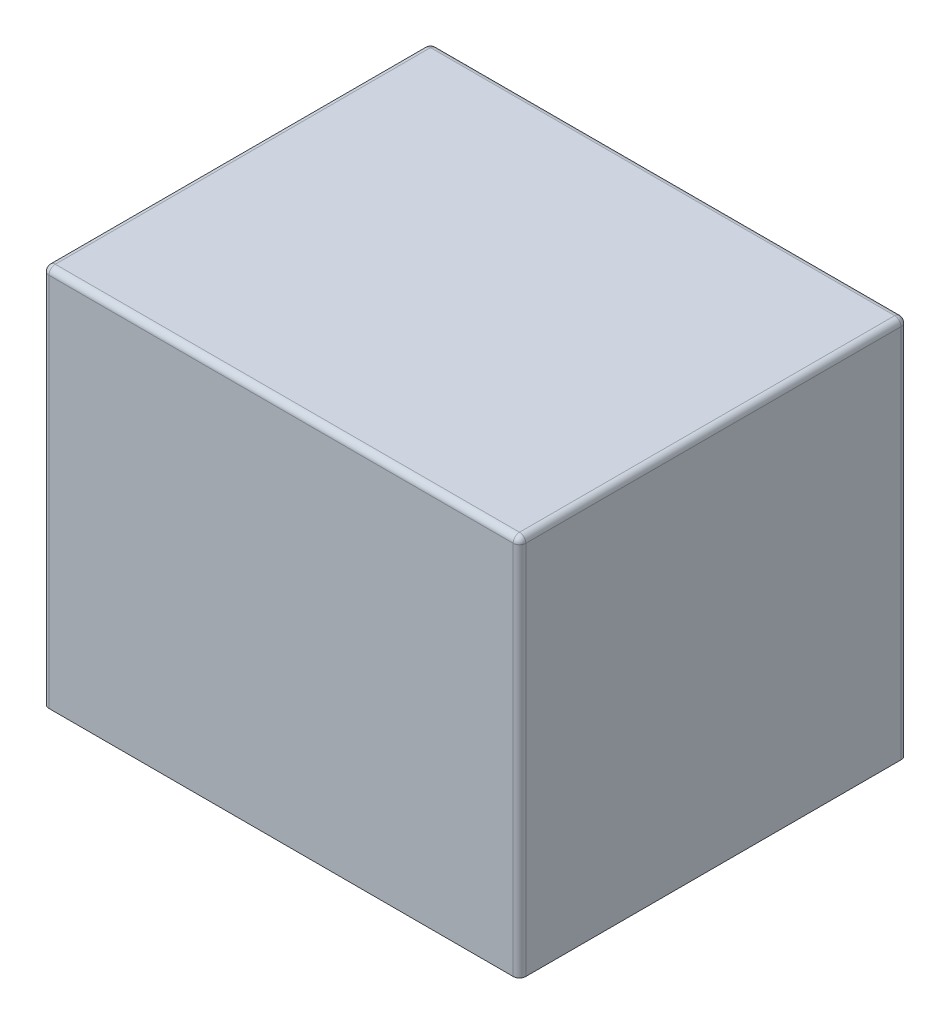
ISO-10303-21;
HEADER;
FILE_DESCRIPTION(('STEP AP214'),'2;1');
FILE_NAME('part.step','',(''),(''),'','','');
FILE_SCHEMA(('AUTOMOTIVE_DESIGN { 1 0 10303 214 1 1 1 1 }'));
ENDSEC;
DATA;
#1=APPLICATION_CONTEXT('core data for automotive mechanical design processes');
#2=APPLICATION_PROTOCOL_DEFINITION('international standard','automotive_design',2000,#1);
#3=PRODUCT_CONTEXT('',#1,'mechanical');
#4=PRODUCT('Part','Part','',(#3));
#5=PRODUCT_RELATED_PRODUCT_CATEGORY('part','',(#4));
#6=PRODUCT_DEFINITION_FORMATION('','',#4);
#7=PRODUCT_DEFINITION_CONTEXT('part definition',#1,'design');
#8=PRODUCT_DEFINITION('design','',#6,#7);
#9=PRODUCT_DEFINITION_SHAPE('','',#8);
#10=(LENGTH_UNIT() NAMED_UNIT(*) SI_UNIT(.MILLI.,.METRE.));
#11=(NAMED_UNIT(*) PLANE_ANGLE_UNIT() SI_UNIT($,.RADIAN.));
#12=(NAMED_UNIT(*) SI_UNIT($,.STERADIAN.) SOLID_ANGLE_UNIT());
#13=UNCERTAINTY_MEASURE_WITH_UNIT(LENGTH_MEASURE(1.E-05),#10,'distance_accuracy_value','');
#14=(GEOMETRIC_REPRESENTATION_CONTEXT(3) GLOBAL_UNCERTAINTY_ASSIGNED_CONTEXT((#13)) GLOBAL_UNIT_ASSIGNED_CONTEXT((#10,
#11,#12)) REPRESENTATION_CONTEXT('',''));
#15=CARTESIAN_POINT('',(0.,0.,0.));
#16=DIRECTION('',(0.,0.,1.));
#17=DIRECTION('',(1.,0.,0.));
#18=AXIS2_PLACEMENT_3D('',#15,#16,#17);
#19=CARTESIAN_POINT('',(0.,0.,-15.494));
#20=DIRECTION('',(-1.,0.,0.));
#21=DIRECTION('',(0.,0.,1.));
#22=AXIS2_PLACEMENT_3D('',#19,#20,#21);
#23=PLANE('',#22);
#24=DIRECTION('',(0.,0.,1.));
#25=VECTOR('',#24,1.);
#26=CARTESIAN_POINT('',(0.,0.,-15.494));
#27=LINE('',#26,#25);
#28=CARTESIAN_POINT('',(0.,0.,-15.24));
#29=VERTEX_POINT('',#28);
#30=CARTESIAN_POINT('',(0.,0.,-0.254000000000001));
#31=VERTEX_POINT('',#30);
#32=EDGE_CURVE('E139',#29,#31,#27,.T.);
#33=ORIENTED_EDGE('',*,*,#32,.T.);
#34=DIRECTION('',(0.,-1.,0.));
#35=VECTOR('',#34,1.);
#36=CARTESIAN_POINT('',(0.,15.24,-0.254));
#37=LINE('',#36,#35);
#38=CARTESIAN_POINT('',(0.,14.986,-0.254));
#39=VERTEX_POINT('',#38);
#40=EDGE_CURVE('E114',#31,#39,#37,.F.);
#41=ORIENTED_EDGE('',*,*,#40,.T.);
#42=DIRECTION('',(0.,0.,1.));
#43=VECTOR('',#42,1.);
#44=CARTESIAN_POINT('',(0.,14.986,-15.494));
#45=LINE('',#44,#43);
#46=CARTESIAN_POINT('',(0.,14.986,-15.24));
#47=VERTEX_POINT('',#46);
#48=EDGE_CURVE('E154',#39,#47,#45,.F.);
#49=ORIENTED_EDGE('',*,*,#48,.T.);
#50=DIRECTION('',(0.,-1.,0.));
#51=VECTOR('',#50,1.);
#52=CARTESIAN_POINT('',(0.,0.,-15.24));
#53=LINE('',#52,#51);
#54=EDGE_CURVE('E119',#47,#29,#53,.T.);
#55=ORIENTED_EDGE('',*,*,#54,.T.);
#56=EDGE_LOOP('',(#33,#41,#49,#55));
#57=FACE_BOUND('',#56,.T.);
#58=ADVANCED_FACE('F33',(#57),#23,.T.);
#59=CARTESIAN_POINT('',(0.,15.24,-15.494));
#60=DIRECTION('',(0.,1.,0.));
#61=DIRECTION('',(0.,0.,1.));
#62=AXIS2_PLACEMENT_3D('',#59,#60,#61);
#63=PLANE('',#62);
#64=DIRECTION('',(-1.,0.,0.));
#65=VECTOR('',#64,1.);
#66=CARTESIAN_POINT('',(0.,15.24,-15.24));
#67=LINE('',#66,#65);
#68=CARTESIAN_POINT('',(18.796,15.24,-15.24));
#69=VERTEX_POINT('',#68);
#70=CARTESIAN_POINT('',(0.254,15.24,-15.24));
#71=VERTEX_POINT('',#70);
#72=EDGE_CURVE('E161',#69,#71,#67,.T.);
#73=ORIENTED_EDGE('',*,*,#72,.T.);
#74=DIRECTION('',(0.,0.,1.));
#75=VECTOR('',#74,1.);
#76=CARTESIAN_POINT('',(0.254,15.24,-15.494));
#77=LINE('',#76,#75);
#78=CARTESIAN_POINT('',(0.254,15.24,-0.254));
#79=VERTEX_POINT('',#78);
#80=EDGE_CURVE('E163',#71,#79,#77,.T.);
#81=ORIENTED_EDGE('',*,*,#80,.T.);
#82=DIRECTION('',(-1.,0.,0.));
#83=VECTOR('',#82,1.);
#84=CARTESIAN_POINT('',(19.05,15.24,-0.254));
#85=LINE('',#84,#83);
#86=CARTESIAN_POINT('',(18.796,15.24,-0.254));
#87=VERTEX_POINT('',#86);
#88=EDGE_CURVE('E157',#79,#87,#85,.F.);
#89=ORIENTED_EDGE('',*,*,#88,.T.);
#90=DIRECTION('',(0.,0.,1.));
#91=VECTOR('',#90,1.);
#92=CARTESIAN_POINT('',(18.796,15.24,-15.494));
#93=LINE('',#92,#91);
#94=EDGE_CURVE('E159',#87,#69,#93,.F.);
#95=ORIENTED_EDGE('',*,*,#94,.T.);
#96=EDGE_LOOP('',(#73,#81,#89,#95));
#97=FACE_BOUND('',#96,.T.);
#98=ADVANCED_FACE('F234',(#97),#63,.T.);
#99=CARTESIAN_POINT('',(19.05,0.,-15.494));
#100=DIRECTION('',(1.,0.,0.));
#101=DIRECTION('',(0.,0.,-1.));
#102=AXIS2_PLACEMENT_3D('',#99,#100,#101);
#103=PLANE('',#102);
#104=DIRECTION('',(0.,0.,1.));
#105=VECTOR('',#104,1.);
#106=CARTESIAN_POINT('',(19.05,0.,-15.494));
#107=LINE('',#106,#105);
#108=CARTESIAN_POINT('',(19.05,0.,-15.24));
#109=VERTEX_POINT('',#108);
#110=CARTESIAN_POINT('',(19.05,0.,-0.254000000000001));
#111=VERTEX_POINT('',#110);
#112=EDGE_CURVE('E144',#109,#111,#107,.T.);
#113=ORIENTED_EDGE('',*,*,#112,.F.);
#114=DIRECTION('',(0.,1.,0.));
#115=VECTOR('',#114,1.);
#116=CARTESIAN_POINT('',(19.05,0.,-15.24));
#117=LINE('',#116,#115);
#118=CARTESIAN_POINT('',(19.05,14.986,-15.24));
#119=VERTEX_POINT('',#118);
#120=EDGE_CURVE('E11',#109,#119,#117,.T.);
#121=ORIENTED_EDGE('',*,*,#120,.T.);
#122=DIRECTION('',(0.,0.,1.));
#123=VECTOR('',#122,1.);
#124=CARTESIAN_POINT('',(19.05,14.986,-15.494));
#125=LINE('',#124,#123);
#126=CARTESIAN_POINT('',(19.05,14.986,-0.254));
#127=VERTEX_POINT('',#126);
#128=EDGE_CURVE('E42',#119,#127,#125,.T.);
#129=ORIENTED_EDGE('',*,*,#128,.T.);
#130=DIRECTION('',(0.,1.,0.));
#131=VECTOR('',#130,1.);
#132=CARTESIAN_POINT('',(19.05,0.,-0.254));
#133=LINE('',#132,#131);
#134=EDGE_CURVE('E172',#127,#111,#133,.F.);
#135=ORIENTED_EDGE('',*,*,#134,.T.);
#136=EDGE_LOOP('',(#113,#121,#129,#135));
#137=FACE_BOUND('',#136,.T.);
#138=ADVANCED_FACE('F245',(#137),#103,.T.);
#139=CARTESIAN_POINT('',(0.,0.,-15.494));
#140=DIRECTION('',(0.,-1.,0.));
#141=DIRECTION('',(0.,0.,-1.));
#142=AXIS2_PLACEMENT_3D('',#139,#140,#141);
#143=PLANE('',#142);
#144=DIRECTION('',(1.,0.,0.));
#145=VECTOR('',#144,1.);
#146=CARTESIAN_POINT('',(0.,0.,0.));
#147=LINE('',#146,#145);
#148=CARTESIAN_POINT('',(0.254,0.,0.));
#149=VERTEX_POINT('',#148);
#150=CARTESIAN_POINT('',(18.796,0.,0.));
#151=VERTEX_POINT('',#150);
#152=EDGE_CURVE('E125',#149,#151,#147,.T.);
#153=ORIENTED_EDGE('',*,*,#152,.F.);
#154=CARTESIAN_POINT('',(0.254,0.,-0.254));
#155=DIRECTION('',(0.,-1.,0.));
#156=DIRECTION('',(0.,0.,-1.));
#157=AXIS2_PLACEMENT_3D('',#154,#155,#156);
#158=CIRCLE('',#157,0.254);
#159=EDGE_CURVE('E109',#149,#31,#158,.T.);
#160=ORIENTED_EDGE('',*,*,#159,.T.);
#161=ORIENTED_EDGE('',*,*,#32,.F.);
#162=CARTESIAN_POINT('',(0.254,0.,-15.24));
#163=DIRECTION('',(0.,-1.,0.));
#164=DIRECTION('',(0.,0.,-1.));
#165=AXIS2_PLACEMENT_3D('',#162,#163,#164);
#166=CIRCLE('',#165,0.254);
#167=CARTESIAN_POINT('',(0.254,0.,-15.494));
#168=VERTEX_POINT('',#167);
#169=EDGE_CURVE('E120',#29,#168,#166,.T.);
#170=ORIENTED_EDGE('',*,*,#169,.T.);
#171=DIRECTION('',(1.,0.,0.));
#172=VECTOR('',#171,1.);
#173=CARTESIAN_POINT('',(0.,0.,-15.494));
#174=LINE('',#173,#172);
#175=CARTESIAN_POINT('',(18.796,0.,-15.494));
#176=VERTEX_POINT('',#175);
#177=EDGE_CURVE('E136',#168,#176,#174,.T.);
#178=ORIENTED_EDGE('',*,*,#177,.T.);
#179=CARTESIAN_POINT('',(18.796,0.,-15.24));
#180=DIRECTION('',(0.,-1.,0.));
#181=DIRECTION('',(0.,0.,-1.));
#182=AXIS2_PLACEMENT_3D('',#179,#180,#181);
#183=CIRCLE('',#182,0.254);
#184=EDGE_CURVE('E150',#176,#109,#183,.T.);
#185=ORIENTED_EDGE('',*,*,#184,.T.);
#186=ORIENTED_EDGE('',*,*,#112,.T.);
#187=CARTESIAN_POINT('',(18.796,0.,-0.254));
#188=DIRECTION('',(0.,-1.,0.));
#189=DIRECTION('',(0.,0.,-1.));
#190=AXIS2_PLACEMENT_3D('',#187,#188,#189);
#191=CIRCLE('',#190,0.254);
#192=EDGE_CURVE('E130',#111,#151,#191,.T.);
#193=ORIENTED_EDGE('',*,*,#192,.T.);
#194=EDGE_LOOP('',(#153,#160,#161,#170,#178,#185,#186,#193));
#195=FACE_BOUND('',#194,.T.);
#196=ADVANCED_FACE('F133',(#195),#143,.T.);
#197=CARTESIAN_POINT('',(0.,0.,-15.494));
#198=DIRECTION('',(0.,0.,-1.));
#199=DIRECTION('',(-1.,0.,0.));
#200=AXIS2_PLACEMENT_3D('',#197,#198,#199);
#201=PLANE('',#200);
#202=ORIENTED_EDGE('',*,*,#177,.F.);
#203=DIRECTION('',(0.,-1.,0.));
#204=VECTOR('',#203,1.);
#205=CARTESIAN_POINT('',(0.254,0.,-15.494));
#206=LINE('',#205,#204);
#207=CARTESIAN_POINT('',(0.254,14.986,-15.494));
#208=VERTEX_POINT('',#207);
#209=EDGE_CURVE('E170',#168,#208,#206,.F.);
#210=ORIENTED_EDGE('',*,*,#209,.T.);
#211=DIRECTION('',(-1.,0.,0.));
#212=VECTOR('',#211,1.);
#213=CARTESIAN_POINT('',(0.,14.986,-15.494));
#214=LINE('',#213,#212);
#215=CARTESIAN_POINT('',(18.796,14.986,-15.494));
#216=VERTEX_POINT('',#215);
#217=EDGE_CURVE('E168',#208,#216,#214,.F.);
#218=ORIENTED_EDGE('',*,*,#217,.T.);
#219=DIRECTION('',(0.,1.,0.));
#220=VECTOR('',#219,1.);
#221=CARTESIAN_POINT('',(18.796,0.,-15.494));
#222=LINE('',#221,#220);
#223=EDGE_CURVE('E166',#216,#176,#222,.F.);
#224=ORIENTED_EDGE('',*,*,#223,.T.);
#225=EDGE_LOOP('',(#202,#210,#218,#224));
#226=FACE_BOUND('',#225,.T.);
#227=ADVANCED_FACE('F218',(#226),#201,.T.);
#228=CARTESIAN_POINT('',(0.,0.,0.));
#229=DIRECTION('',(0.,0.,-1.));
#230=DIRECTION('',(-1.,0.,0.));
#231=AXIS2_PLACEMENT_3D('',#228,#229,#230);
#232=PLANE('',#231);
#233=DIRECTION('',(-1.,0.,0.));
#234=VECTOR('',#233,1.);
#235=CARTESIAN_POINT('',(0.,14.986,0.));
#236=LINE('',#235,#234);
#237=CARTESIAN_POINT('',(18.796,14.986,0.));
#238=VERTEX_POINT('',#237);
#239=CARTESIAN_POINT('',(0.254,14.986,0.));
#240=VERTEX_POINT('',#239);
#241=EDGE_CURVE('E128',#238,#240,#236,.T.);
#242=ORIENTED_EDGE('',*,*,#241,.T.);
#243=DIRECTION('',(0.,-1.,0.));
#244=VECTOR('',#243,1.);
#245=CARTESIAN_POINT('',(0.254,0.,0.));
#246=LINE('',#245,#244);
#247=EDGE_CURVE('E113',#240,#149,#246,.T.);
#248=ORIENTED_EDGE('',*,*,#247,.T.);
#249=ORIENTED_EDGE('',*,*,#152,.T.);
#250=DIRECTION('',(0.,1.,0.));
#251=VECTOR('',#250,1.);
#252=CARTESIAN_POINT('',(18.796,15.24,0.));
#253=LINE('',#252,#251);
#254=EDGE_CURVE('E131',#151,#238,#253,.T.);
#255=ORIENTED_EDGE('',*,*,#254,.T.);
#256=EDGE_LOOP('',(#242,#248,#249,#255));
#257=FACE_BOUND('',#256,.T.);
#258=ADVANCED_FACE('F124',(#257),#232,.F.);
#259=CARTESIAN_POINT('',(18.796,0.,-15.24));
#260=DIRECTION('',(0.,1.,0.));
#261=DIRECTION('',(0.,0.,1.));
#262=AXIS2_PLACEMENT_3D('',#259,#260,#261);
#263=CYLINDRICAL_SURFACE('',#262,0.254);
#264=CARTESIAN_POINT('',(18.796,14.986,-15.24));
#265=DIRECTION('',(0.,1.,0.));
#266=DIRECTION('',(0.,0.,1.));
#267=AXIS2_PLACEMENT_3D('',#264,#265,#266);
#268=CIRCLE('',#267,0.254);
#269=EDGE_CURVE('E37',#119,#216,#268,.T.);
#270=ORIENTED_EDGE('',*,*,#269,.F.);
#271=ORIENTED_EDGE('',*,*,#120,.F.);
#272=ORIENTED_EDGE('',*,*,#184,.F.);
#273=ORIENTED_EDGE('',*,*,#223,.F.);
#274=EDGE_LOOP('',(#270,#271,#272,#273));
#275=FACE_BOUND('',#274,.T.);
#276=ADVANCED_FACE('F35',(#275),#263,.T.);
#277=CARTESIAN_POINT('',(18.796,14.986,-15.24));
#278=DIRECTION('',(0.,0.,1.));
#279=DIRECTION('',(1.,0.,0.));
#280=AXIS2_PLACEMENT_3D('',#277,#278,#279);
#281=SPHERICAL_SURFACE('',#280,0.254);
#282=CARTESIAN_POINT('',(18.796,14.986,-15.24));
#283=DIRECTION('',(0.,0.,-1.));
#284=DIRECTION('',(-1.,0.,0.));
#285=AXIS2_PLACEMENT_3D('',#282,#283,#284);
#286=CIRCLE('',#285,0.254);
#287=EDGE_CURVE('E200',#119,#69,#286,.F.);
#288=ORIENTED_EDGE('',*,*,#287,.F.);
#289=ORIENTED_EDGE('',*,*,#269,.T.);
#290=CARTESIAN_POINT('',(18.796,14.986,-15.24));
#291=DIRECTION('',(1.,0.,0.));
#292=DIRECTION('',(0.,0.,-1.));
#293=AXIS2_PLACEMENT_3D('',#290,#291,#292);
#294=CIRCLE('',#293,0.254);
#295=EDGE_CURVE('E142',#69,#216,#294,.F.);
#296=ORIENTED_EDGE('',*,*,#295,.F.);
#297=EDGE_LOOP('',(#288,#289,#296));
#298=FACE_BOUND('',#297,.T.);
#299=ADVANCED_FACE('F212',(#298),#281,.T.);
#300=CARTESIAN_POINT('',(0.254,0.,-15.24));
#301=DIRECTION('',(0.,-1.,0.));
#302=DIRECTION('',(0.,0.,-1.));
#303=AXIS2_PLACEMENT_3D('',#300,#301,#302);
#304=CYLINDRICAL_SURFACE('',#303,0.254);
#305=ORIENTED_EDGE('',*,*,#169,.F.);
#306=ORIENTED_EDGE('',*,*,#54,.F.);
#307=CARTESIAN_POINT('',(0.254,14.986,-15.24));
#308=DIRECTION('',(0.,1.,0.));
#309=DIRECTION('',(0.,0.,1.));
#310=AXIS2_PLACEMENT_3D('',#307,#308,#309);
#311=CIRCLE('',#310,0.254);
#312=EDGE_CURVE('E197',#208,#47,#311,.T.);
#313=ORIENTED_EDGE('',*,*,#312,.F.);
#314=ORIENTED_EDGE('',*,*,#209,.F.);
#315=EDGE_LOOP('',(#305,#306,#313,#314));
#316=FACE_BOUND('',#315,.T.);
#317=ADVANCED_FACE('F223',(#316),#304,.T.);
#318=CARTESIAN_POINT('',(0.,14.986,-15.24));
#319=DIRECTION('',(-1.,0.,0.));
#320=DIRECTION('',(0.,0.,1.));
#321=AXIS2_PLACEMENT_3D('',#318,#319,#320);
#322=CYLINDRICAL_SURFACE('',#321,0.254);
#323=ORIENTED_EDGE('',*,*,#295,.T.);
#324=ORIENTED_EDGE('',*,*,#217,.F.);
#325=CARTESIAN_POINT('',(0.254,14.986,-15.24));
#326=DIRECTION('',(-1.,0.,0.));
#327=DIRECTION('',(0.,0.,1.));
#328=AXIS2_PLACEMENT_3D('',#325,#326,#327);
#329=CIRCLE('',#328,0.254);
#330=EDGE_CURVE('E194',#71,#208,#329,.T.);
#331=ORIENTED_EDGE('',*,*,#330,.F.);
#332=ORIENTED_EDGE('',*,*,#72,.F.);
#333=EDGE_LOOP('',(#323,#324,#331,#332));
#334=FACE_BOUND('',#333,.T.);
#335=ADVANCED_FACE('F207',(#334),#322,.T.);
#336=CARTESIAN_POINT('',(18.796,14.986,-15.494));
#337=DIRECTION('',(0.,0.,1.));
#338=DIRECTION('',(1.,0.,0.));
#339=AXIS2_PLACEMENT_3D('',#336,#337,#338);
#340=CYLINDRICAL_SURFACE('',#339,0.254);
#341=ORIENTED_EDGE('',*,*,#287,.T.);
#342=ORIENTED_EDGE('',*,*,#94,.F.);
#343=CARTESIAN_POINT('',(18.796,14.986,-0.254));
#344=DIRECTION('',(0.,0.,1.));
#345=DIRECTION('',(1.,0.,0.));
#346=AXIS2_PLACEMENT_3D('',#343,#344,#345);
#347=CIRCLE('',#346,0.254);
#348=EDGE_CURVE('E191',#127,#87,#347,.T.);
#349=ORIENTED_EDGE('',*,*,#348,.F.);
#350=ORIENTED_EDGE('',*,*,#128,.F.);
#351=EDGE_LOOP('',(#341,#342,#349,#350));
#352=FACE_BOUND('',#351,.T.);
#353=ADVANCED_FACE('F238',(#352),#340,.T.);
#354=CARTESIAN_POINT('',(18.796,0.,-0.254));
#355=DIRECTION('',(0.,-1.,0.));
#356=DIRECTION('',(0.,0.,-1.));
#357=AXIS2_PLACEMENT_3D('',#354,#355,#356);
#358=CYLINDRICAL_SURFACE('',#357,0.254);
#359=ORIENTED_EDGE('',*,*,#192,.F.);
#360=ORIENTED_EDGE('',*,*,#134,.F.);
#361=CARTESIAN_POINT('',(18.796,14.986,-0.254));
#362=DIRECTION('',(0.,1.,0.));
#363=DIRECTION('',(0.,0.,1.));
#364=AXIS2_PLACEMENT_3D('',#361,#362,#363);
#365=CIRCLE('',#364,0.254);
#366=EDGE_CURVE('E188',#238,#127,#365,.T.);
#367=ORIENTED_EDGE('',*,*,#366,.F.);
#368=ORIENTED_EDGE('',*,*,#254,.F.);
#369=EDGE_LOOP('',(#359,#360,#367,#368));
#370=FACE_BOUND('',#369,.T.);
#371=ADVANCED_FACE('F244',(#370),#358,.T.);
#372=CARTESIAN_POINT('',(0.254,14.986,-15.24));
#373=DIRECTION('',(0.,0.,1.));
#374=DIRECTION('',(1.,0.,0.));
#375=AXIS2_PLACEMENT_3D('',#372,#373,#374);
#376=SPHERICAL_SURFACE('',#375,0.254);
#377=ORIENTED_EDGE('',*,*,#330,.T.);
#378=ORIENTED_EDGE('',*,*,#312,.T.);
#379=CARTESIAN_POINT('',(0.254,14.986,-15.24));
#380=DIRECTION('',(0.,0.,-1.));
#381=DIRECTION('',(-1.,0.,0.));
#382=AXIS2_PLACEMENT_3D('',#379,#380,#381);
#383=CIRCLE('',#382,0.254);
#384=EDGE_CURVE('E185',#71,#47,#383,.F.);
#385=ORIENTED_EDGE('',*,*,#384,.F.);
#386=EDGE_LOOP('',(#377,#378,#385));
#387=FACE_BOUND('',#386,.T.);
#388=ADVANCED_FACE('F226',(#387),#376,.T.);
#389=CARTESIAN_POINT('',(18.796,14.986,-0.254));
#390=DIRECTION('',(0.,0.,1.));
#391=DIRECTION('',(1.,0.,0.));
#392=AXIS2_PLACEMENT_3D('',#389,#390,#391);
#393=SPHERICAL_SURFACE('',#392,0.254);
#394=ORIENTED_EDGE('',*,*,#366,.T.);
#395=ORIENTED_EDGE('',*,*,#348,.T.);
#396=CARTESIAN_POINT('',(18.796,14.986,-0.254));
#397=DIRECTION('',(1.,0.,0.));
#398=DIRECTION('',(0.,0.,-1.));
#399=AXIS2_PLACEMENT_3D('',#396,#397,#398);
#400=CIRCLE('',#399,0.254);
#401=EDGE_CURVE('E182',#238,#87,#400,.F.);
#402=ORIENTED_EDGE('',*,*,#401,.F.);
#403=EDGE_LOOP('',(#394,#395,#402));
#404=FACE_BOUND('',#403,.T.);
#405=ADVANCED_FACE('F242',(#404),#393,.T.);
#406=CARTESIAN_POINT('',(0.254,14.986,-15.494));
#407=DIRECTION('',(0.,0.,1.));
#408=DIRECTION('',(1.,0.,0.));
#409=AXIS2_PLACEMENT_3D('',#406,#407,#408);
#410=CYLINDRICAL_SURFACE('',#409,0.254);
#411=ORIENTED_EDGE('',*,*,#384,.T.);
#412=ORIENTED_EDGE('',*,*,#48,.F.);
#413=CARTESIAN_POINT('',(0.254,14.986,-0.254));
#414=DIRECTION('',(0.,0.,1.));
#415=DIRECTION('',(1.,0.,0.));
#416=AXIS2_PLACEMENT_3D('',#413,#414,#415);
#417=CIRCLE('',#416,0.254);
#418=EDGE_CURVE('E179',#79,#39,#417,.T.);
#419=ORIENTED_EDGE('',*,*,#418,.F.);
#420=ORIENTED_EDGE('',*,*,#80,.F.);
#421=EDGE_LOOP('',(#411,#412,#419,#420));
#422=FACE_BOUND('',#421,.T.);
#423=ADVANCED_FACE('F231',(#422),#410,.T.);
#424=CARTESIAN_POINT('',(0.,14.986,-0.254));
#425=DIRECTION('',(1.,0.,0.));
#426=DIRECTION('',(0.,0.,-1.));
#427=AXIS2_PLACEMENT_3D('',#424,#425,#426);
#428=CYLINDRICAL_SURFACE('',#427,0.254);
#429=ORIENTED_EDGE('',*,*,#401,.T.);
#430=ORIENTED_EDGE('',*,*,#88,.F.);
#431=CARTESIAN_POINT('',(0.254,14.986,-0.254));
#432=DIRECTION('',(-1.,0.,0.));
#433=DIRECTION('',(0.,0.,1.));
#434=AXIS2_PLACEMENT_3D('',#431,#432,#433);
#435=CIRCLE('',#434,0.254);
#436=EDGE_CURVE('E177',#240,#79,#435,.T.);
#437=ORIENTED_EDGE('',*,*,#436,.F.);
#438=ORIENTED_EDGE('',*,*,#241,.F.);
#439=EDGE_LOOP('',(#429,#430,#437,#438));
#440=FACE_BOUND('',#439,.T.);
#441=ADVANCED_FACE('F265',(#440),#428,.T.);
#442=CARTESIAN_POINT('',(0.254,14.986,-0.254));
#443=DIRECTION('',(0.,0.,1.));
#444=DIRECTION('',(1.,0.,0.));
#445=AXIS2_PLACEMENT_3D('',#442,#443,#444);
#446=SPHERICAL_SURFACE('',#445,0.254);
#447=ORIENTED_EDGE('',*,*,#436,.T.);
#448=ORIENTED_EDGE('',*,*,#418,.T.);
#449=CARTESIAN_POINT('',(0.254,14.986,-0.254));
#450=DIRECTION('',(0.,1.,0.));
#451=DIRECTION('',(0.,0.,1.));
#452=AXIS2_PLACEMENT_3D('',#449,#450,#451);
#453=CIRCLE('',#452,0.254);
#454=EDGE_CURVE('E175',#240,#39,#453,.F.);
#455=ORIENTED_EDGE('',*,*,#454,.F.);
#456=EDGE_LOOP('',(#447,#448,#455));
#457=FACE_BOUND('',#456,.T.);
#458=ADVANCED_FACE('F262',(#457),#446,.T.);
#459=CARTESIAN_POINT('',(0.254,0.,-0.254));
#460=DIRECTION('',(0.,1.,0.));
#461=DIRECTION('',(0.,0.,1.));
#462=AXIS2_PLACEMENT_3D('',#459,#460,#461);
#463=CYLINDRICAL_SURFACE('',#462,0.254);
#464=ORIENTED_EDGE('',*,*,#454,.T.);
#465=ORIENTED_EDGE('',*,*,#40,.F.);
#466=ORIENTED_EDGE('',*,*,#159,.F.);
#467=ORIENTED_EDGE('',*,*,#247,.F.);
#468=EDGE_LOOP('',(#464,#465,#466,#467));
#469=FACE_BOUND('',#468,.T.);
#470=ADVANCED_FACE('F112',(#469),#463,.T.);
#471=CLOSED_SHELL('',(#58,#98,#138,#196,#227,#258,#276,#299,#317,#335,#353,#371,#388,#405,#423,
#441,#458,#470));
#472=MANIFOLD_SOLID_BREP('B2',#471);
#473=ADVANCED_BREP_SHAPE_REPRESENTATION('',(#18,#472),#14);
#474=SHAPE_DEFINITION_REPRESENTATION(#9,#473);
ENDSEC;
END-ISO-10303-21;
